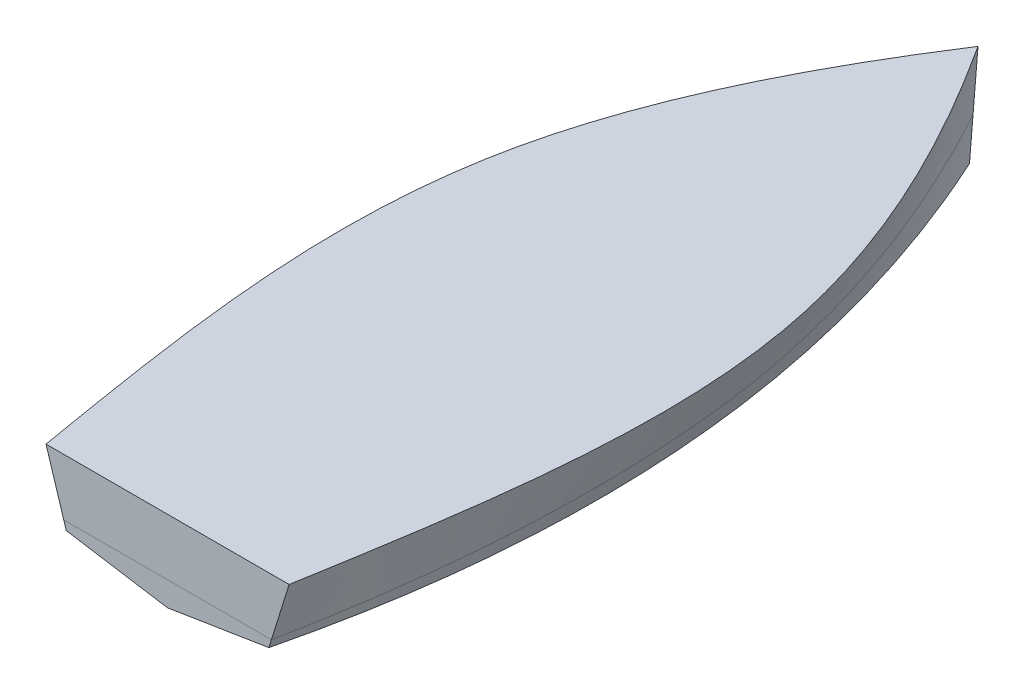
ISO-10303-21;
HEADER;
FILE_DESCRIPTION(('STEP AP214'),'2;1');
FILE_NAME('part.step','',(''),(''),'','','');
FILE_SCHEMA(('AUTOMOTIVE_DESIGN { 1 0 10303 214 1 1 1 1 }'));
ENDSEC;
DATA;
#1=APPLICATION_CONTEXT('core data for automotive mechanical design processes');
#2=APPLICATION_PROTOCOL_DEFINITION('international standard','automotive_design',2000,#1);
#3=PRODUCT_CONTEXT('',#1,'mechanical');
#4=PRODUCT('Part','Part','',(#3));
#5=PRODUCT_RELATED_PRODUCT_CATEGORY('part','',(#4));
#6=PRODUCT_DEFINITION_FORMATION('','',#4);
#7=PRODUCT_DEFINITION_CONTEXT('part definition',#1,'design');
#8=PRODUCT_DEFINITION('design','',#6,#7);
#9=PRODUCT_DEFINITION_SHAPE('','',#8);
#10=(LENGTH_UNIT() NAMED_UNIT(*) SI_UNIT(.MILLI.,.METRE.));
#11=(NAMED_UNIT(*) PLANE_ANGLE_UNIT() SI_UNIT($,.RADIAN.));
#12=(NAMED_UNIT(*) SI_UNIT($,.STERADIAN.) SOLID_ANGLE_UNIT());
#13=UNCERTAINTY_MEASURE_WITH_UNIT(LENGTH_MEASURE(1.E-05),#10,'distance_accuracy_value','');
#14=(GEOMETRIC_REPRESENTATION_CONTEXT(3) GLOBAL_UNCERTAINTY_ASSIGNED_CONTEXT((#13)) GLOBAL_UNIT_ASSIGNED_CONTEXT((#10,
#11,#12)) REPRESENTATION_CONTEXT('',''));
#15=CARTESIAN_POINT('',(0.,0.,0.));
#16=DIRECTION('',(0.,0.,1.));
#17=DIRECTION('',(1.,0.,0.));
#18=AXIS2_PLACEMENT_3D('',#15,#16,#17);
#19=CARTESIAN_POINT('',(0.,-70.,0.));
#20=DIRECTION('',(0.,1.,0.));
#21=DIRECTION('',(0.,0.,1.));
#22=AXIS2_PLACEMENT_3D('',#19,#20,#21);
#23=PLANE('',#22);
#24=CARTESIAN_POINT('',(0.,-70.,6.1242064468144));
#25=CARTESIAN_POINT('',(3.4128996424551,-70.,12.3696890501461));
#26=CARTESIAN_POINT('',(6.7876608261751,-70.,18.6360596045444));
#27=CARTESIAN_POINT('',(13.4590214502835,-70.,31.2133674528269));
#28=CARTESIAN_POINT('',(16.7555901693456,-70.,37.5243210394499));
#29=CARTESIAN_POINT('',(23.2669106603132,-70.,50.1904563174513));
#30=CARTESIAN_POINT('',(26.4816402437373,-70.,56.5456494207862));
#31=CARTESIAN_POINT('',(32.8256578527696,-70.,69.2998757351345));
#32=CARTESIAN_POINT('',(35.9549315288792,-70.,75.6989160859157));
#33=CARTESIAN_POINT('',(42.1244667860507,-70.,88.5404307637073));
#34=CARTESIAN_POINT('',(45.1647209844516,-70.,94.9829086389232));
#35=CARTESIAN_POINT('',(51.1527031471199,-70.,107.910861215993));
#36=CARTESIAN_POINT('',(54.1004296362348,-70.,114.396336601353));
#37=CARTESIAN_POINT('',(59.9053601677149,-70.,127.422050551303));
#38=CARTESIAN_POINT('',(62.7623869533534,-70.,133.962368140657));
#39=CARTESIAN_POINT('',(68.3766957798379,-70.,147.085151857913));
#40=CARTESIAN_POINT('',(71.1339847582742,-70.,153.667615016609));
#41=CARTESIAN_POINT('',(76.5455047257855,-70.,166.874135379851));
#42=CARTESIAN_POINT('',(79.1997443929159,-70.,173.498189027137));
#43=CARTESIAN_POINT('',(84.4019476211753,-70.,186.78729903778));
#44=CARTESIAN_POINT('',(86.9499197189154,-70.,193.452352058056));
#45=CARTESIAN_POINT('',(91.9364735276553,-70.,206.822825439343));
#46=CARTESIAN_POINT('',(94.3750616011719,-70.,213.528243426654));
#47=CARTESIAN_POINT('',(99.1398509410463,-70.,226.97877726238));
#48=CARTESIAN_POINT('',(101.466054243301,-70.,233.723892389179));
#49=CARTESIAN_POINT('',(105.811352322696,-70.,246.681019288286));
#50=CARTESIAN_POINT('',(107.839785803749,-70.,252.889900314483));
#51=CARTESIAN_POINT('',(111.79779212802,-70.,265.339193843847));
#52=CARTESIAN_POINT('',(113.727363740606,-70.,271.57960673846));
#53=CARTESIAN_POINT('',(117.485503538348,-70.,284.090759520209));
#54=CARTESIAN_POINT('',(119.314072024437,-70.,290.361499316927));
#55=CARTESIAN_POINT('',(122.868218090465,-70.,302.932065214998));
#56=CARTESIAN_POINT('',(124.593796306794,-70.,309.231891136364));
#57=CARTESIAN_POINT('',(127.940134509855,-70.,321.859338251998));
#58=CARTESIAN_POINT('',(129.56089432697,-70.,328.186959491225));
#59=CARTESIAN_POINT('',(132.69392395138,-70.,340.860507059389));
#60=CARTESIAN_POINT('',(134.206328602835,-70.,347.2064000417));
#61=CARTESIAN_POINT('',(137.123413883221,-70.,359.922957102391));
#62=CARTESIAN_POINT('',(138.528093477159,-70.,366.293621418151));
#63=CARTESIAN_POINT('',(141.22840967873,-70.,379.058067381411));
#64=CARTESIAN_POINT('',(142.524046184481,-70.,385.451849050506));
#65=CARTESIAN_POINT('',(144.384876863121,-70.,395.058450870037));
#66=CARTESIAN_POINT('',(144.991385520873,-70.,398.263320260298));
#67=CARTESIAN_POINT('',(146.176750380898,-70.,404.67817612804));
#68=CARTESIAN_POINT('',(146.755606599073,-70.,407.888162602577));
#69=CARTESIAN_POINT('',(147.885573202847,-70.,414.31301830618));
#70=CARTESIAN_POINT('',(148.43668355236,-70.,417.52788754159));
#71=CARTESIAN_POINT('',(149.511027257782,-70.,423.962283809902));
#72=CARTESIAN_POINT('',(150.034260564087,-70.,427.181810851083));
#73=CARTESIAN_POINT('',(151.187380478373,-70.,434.474838175855));
#74=CARTESIAN_POINT('',(151.809006140669,-70.,438.549647815221));
#75=CARTESIAN_POINT('',(153.00876033824,-70.,446.705655007056));
#76=CARTESIAN_POINT('',(153.586888742172,-70.,450.786852578776));
#77=CARTESIAN_POINT('',(155.257089620103,-70.,463.039685442321));
#78=CARTESIAN_POINT('',(156.284915577723,-70.,471.220166671037));
#79=CARTESIAN_POINT('',(158.174767411818,-70.,487.600755997638));
#80=CARTESIAN_POINT('',(159.036781034996,-70.,495.800865500724));
#81=CARTESIAN_POINT('',(160.600509670696,-70.,512.216666934043));
#82=CARTESIAN_POINT('',(161.302218269274,-70.,520.432359474509));
#83=CARTESIAN_POINT('',(162.550810494928,-70.,536.875166159789));
#84=CARTESIAN_POINT('',(163.09769961369,-70.,545.102279889069));
#85=CARTESIAN_POINT('',(164.04325397102,-70.,561.584151512414));
#86=CARTESIAN_POINT('',(164.441572157311,-70.,569.83892924329));
#87=CARTESIAN_POINT('',(165.093554072465,-70.,586.353631504746));
#88=CARTESIAN_POINT('',(165.347227102588,-70.,594.613555670188));
#89=CARTESIAN_POINT('',(165.715159262482,-70.,611.136387716201));
#90=CARTESIAN_POINT('',(165.829419935348,-70.,619.399295562735));
#91=CARTESIAN_POINT('',(165.923516119478,-70.,635.925937675694));
#92=CARTESIAN_POINT('',(165.903350235586,-70.,644.189671949807));
#93=CARTESIAN_POINT('',(165.733315193331,-70.,660.715803327388));
#94=CARTESIAN_POINT('',(165.583445599789,-70.,668.978200426278));
#95=CARTESIAN_POINT('',(165.137916634204,-70.,686.297685799774));
#96=CARTESIAN_POINT('',(164.829573639235,-70.,695.354448094582));
#97=CARTESIAN_POINT('',(164.067668455385,-70.,713.461950652483));
#98=CARTESIAN_POINT('',(163.614104269412,-70.,722.512690831043));
#99=CARTESIAN_POINT('',(162.566647651155,-70.,740.606504173481));
#100=CARTESIAN_POINT('',(161.972747835636,-70.,749.649576908834));
#101=CARTESIAN_POINT('',(160.648981412006,-70.,767.726357119366));
#102=CARTESIAN_POINT('',(159.919105645369,-70.,776.760063922476));
#103=CARTESIAN_POINT('',(158.327204625574,-70.,794.816378165157));
#104=CARTESIAN_POINT('',(157.465171125837,-70.,803.838984876649));
#105=CARTESIAN_POINT('',(155.612214684833,-70.,821.871323998958));
#106=CARTESIAN_POINT('',(154.621286328204,-70.,830.881055852765));
#107=CARTESIAN_POINT('',(152.519280702925,-70.,848.834131909316));
#108=CARTESIAN_POINT('',(151.408924673407,-70.,857.777560627335));
#109=CARTESIAN_POINT('',(149.065518391688,-70.,875.648101815468));
#110=CARTESIAN_POINT('',(147.832471148106,-70.,884.575214680212));
#111=CARTESIAN_POINT('',(145.245183357205,-70.,902.41108458568));
#112=CARTESIAN_POINT('',(143.89095296724,-70.,911.319843100917));
#113=CARTESIAN_POINT('',(141.062209296817,-70.,929.116923987394));
#114=CARTESIAN_POINT('',(139.587713837209,-70.,938.005249186469));
#115=CARTESIAN_POINT('',(137.285915840591,-70.,951.321131850524));
#116=CARTESIAN_POINT('',(136.503726512897,-70.,955.756532657071));
#117=CARTESIAN_POINT('',(134.90923470165,-70.,964.62192569371));
#118=CARTESIAN_POINT('',(134.096932223273,-70.,969.051917924732));
#119=CARTESIAN_POINT('',(132.442369187053,-70.,977.905037484698));
#120=CARTESIAN_POINT('',(131.600116959001,-70.,982.328166370821));
#121=CARTESIAN_POINT('',(129.885314170719,-70.,991.168549245602));
#122=CARTESIAN_POINT('',(129.012763594738,-70.,995.585803231204));
#123=CARTESIAN_POINT('',(128.125,-70.,1000.));
#124=B_SPLINE_CURVE_WITH_KNOTS('',3,(#24,#25,#26,#27,#28,#29,#30,#31,#32,#33,#34,#35,#36,#37,
#38,#39,#40,#41,#42,#43,#44,#45,#46,#47,#48,#49,#50,#51,#52,#53,#54,#55,#56,#57,#58,#59,#60,#61,
#62,#63,#64,#65,#66,#67,#68,#69,#70,#71,#72,#73,#74,#75,#76,#77,#78,#79,#80,#81,#82,#83,#84,#85,
#86,#87,#88,#89,#90,#91,#92,#93,#94,#95,#96,#97,#98,#99,#100,#101,#102,#103,#104,#105,#106,#107,
#108,#109,#110,#111,#112,#113,#114,#115,#116,#117,#118,#119,#120,#121,#122,#123),.UNSPECIFIED.,
.F.,.F.,(4,2,2,2,2,2,2,2,2,2,2,2,2,2,2,2,2,2,2,2,2,2,2,2,2,2,2,2,2,2,2,2,2,2,2,2,2,2,2,2,2,2,2,
2,2,2,2,2,2,4),(0.,21.3514016836477,42.7110577150538,64.0764444633371,85.4453970339877,
106.816116807164,128.187177116991,149.597711011566,171.006752751134,192.413987650576,
213.819499553865,235.223764748541,256.627642050524,276.222321493708,295.817244792058,
315.412109705655,335.006853527921,354.601629057411,374.171580051483,393.741719045032,
413.311876323387,423.097039618363,432.882197285851,442.667367678865,452.452555482618,
464.818154291249,477.183790436997,501.916259745676,526.650556047249,551.385841816156,
576.120250076345,600.912079783073,625.702315096618,650.492276015334,675.282494218722,
700.072795597889,727.257595537645,754.442769340425,781.62937370829,808.817809865744,
836.007943259661,863.199219383548,890.234637635139,917.269393090513,944.301884659544,
971.330377812152,984.841821579968,998.353263025514,1011.86097554307,1025.36869508331),.UNSPECIFIED.);
#125=CARTESIAN_POINT('',(0.,-70.,6.12420644681441));
#126=VERTEX_POINT('',#125);
#127=CARTESIAN_POINT('',(128.125,-70.,1000.));
#128=VERTEX_POINT('',#127);
#129=EDGE_CURVE('E165',#126,#128,#124,.T.);
#130=ORIENTED_EDGE('',*,*,#129,.F.);
#131=CARTESIAN_POINT('',(-128.125,-70.,1000.));
#132=CARTESIAN_POINT('',(-129.524865185264,-70.,993.039324332395));
#133=CARTESIAN_POINT('',(-130.886955129951,-70.,986.071058513881));
#134=CARTESIAN_POINT('',(-133.536063094098,-70.,972.11975164388));
#135=CARTESIAN_POINT('',(-134.82307571117,-70.,965.136709566501));
#136=CARTESIAN_POINT('',(-137.322377245818,-70.,951.156860148106));
#137=CARTESIAN_POINT('',(-138.534661927157,-70.,944.160052049871));
#138=CARTESIAN_POINT('',(-140.8845463001,-70.,930.15362179995));
#139=CARTESIAN_POINT('',(-142.022143043193,-70.,923.14399915359));
#140=CARTESIAN_POINT('',(-144.22246785447,-70.,909.112855564446));
#141=CARTESIAN_POINT('',(-145.285194285947,-70.,902.091334364987));
#142=CARTESIAN_POINT('',(-147.335353517863,-70.,888.037268705765));
#143=CARTESIAN_POINT('',(-148.32278591639,-70.,881.004724187365));
#144=CARTESIAN_POINT('',(-150.225347825442,-70.,866.902414755704));
#145=CARTESIAN_POINT('',(-151.140185728508,-70.,859.832610490352));
#146=CARTESIAN_POINT('',(-152.892438264752,-70.,845.683479721902));
#147=CARTESIAN_POINT('',(-153.729853643997,-70.,838.604153311228));
#148=CARTESIAN_POINT('',(-155.326133846802,-70.,824.436742326568));
#149=CARTESIAN_POINT('',(-156.084999728256,-70.,817.348657871835));
#150=CARTESIAN_POINT('',(-157.522826364551,-70.,803.164471916175));
#151=CARTESIAN_POINT('',(-158.201788102179,-70.,796.068370514937));
#152=CARTESIAN_POINT('',(-159.478228660789,-70.,781.868869768834));
#153=CARTESIAN_POINT('',(-160.075707853568,-70.,774.765470457418));
#154=CARTESIAN_POINT('',(-161.1873867516,-70.,760.552068484694));
#155=CARTESIAN_POINT('',(-161.701585512265,-70.,753.442065749408));
#156=CARTESIAN_POINT('',(-162.628364727964,-70.,739.46239318378));
#157=CARTESIAN_POINT('',(-163.043844552611,-70.,732.592915663125));
#158=CARTESIAN_POINT('',(-163.793292727491,-70.,718.849456637679));
#159=CARTESIAN_POINT('',(-164.127260489122,-70.,711.975475100723));
#160=CARTESIAN_POINT('',(-164.711504901674,-70.,698.223961342942));
#161=CARTESIAN_POINT('',(-164.961781718788,-70.,691.346429129195));
#162=CARTESIAN_POINT('',(-165.376305071745,-70.,677.588760623637));
#163=CARTESIAN_POINT('',(-165.540551583811,-70.,670.708624331107));
#164=CARTESIAN_POINT('',(-165.780520227699,-70.,656.94669021801));
#165=CARTESIAN_POINT('',(-165.856240982989,-70.,650.064892373272));
#166=CARTESIAN_POINT('',(-165.916513527929,-70.,636.300572879547));
#167=CARTESIAN_POINT('',(-165.901061177205,-70.,629.418051211882));
#168=CARTESIAN_POINT('',(-165.776304090553,-70.,615.665037054963));
#169=CARTESIAN_POINT('',(-165.667151988758,-70.,608.794543201619));
#170=CARTESIAN_POINT('',(-165.352313516021,-70.,595.055562554666));
#171=CARTESIAN_POINT('',(-165.146624462142,-70.,588.187075822148));
#172=CARTESIAN_POINT('',(-164.635728533983,-70.,574.45387731137));
#173=CARTESIAN_POINT('',(-164.330522923748,-70.,567.589165486272));
#174=CARTESIAN_POINT('',(-163.617531894974,-70.,553.865287040966));
#175=CARTESIAN_POINT('',(-163.209749950602,-70.,547.006120240845));
#176=CARTESIAN_POINT('',(-162.288476134433,-70.,533.295112770006));
#177=CARTESIAN_POINT('',(-161.774987883591,-70.,526.443271856419));
#178=CARTESIAN_POINT('',(-160.639109404853,-70.,512.748674689519));
#179=CARTESIAN_POINT('',(-160.016720533441,-70.,505.905918324118));
#180=CARTESIAN_POINT('',(-158.802352475327,-70.,493.667851261194));
#181=CARTESIAN_POINT('',(-158.231450600031,-70.,488.270441327337));
#182=CARTESIAN_POINT('',(-157.01810347386,-70.,477.483653629842));
#183=CARTESIAN_POINT('',(-156.3756582558,-70.,472.09427586252));
#184=CARTESIAN_POINT('',(-155.017666810365,-70.,461.324844191656));
#185=CARTESIAN_POINT('',(-154.302121995375,-70.,455.944790110009));
#186=CARTESIAN_POINT('',(-152.796374909512,-70.,445.195248361081));
#187=CARTESIAN_POINT('',(-152.006174534148,-70.,439.825760429058));
#188=CARTESIAN_POINT('',(-150.763753537846,-70.,431.780437646124));
#189=CARTESIAN_POINT('',(-150.340095842457,-70.,429.100164266645));
#190=CARTESIAN_POINT('',(-149.473526904917,-70.,423.742726875653));
#191=CARTESIAN_POINT('',(-149.030615664127,-70.,421.065562863921));
#192=CARTESIAN_POINT('',(-148.125526383158,-70.,415.714502218447));
#193=CARTESIAN_POINT('',(-147.663348402903,-70.,413.040605574568));
#194=CARTESIAN_POINT('',(-146.719792486462,-70.,407.696206867928));
#195=CARTESIAN_POINT('',(-146.238414547799,-70.,405.025704805604));
#196=CARTESIAN_POINT('',(-144.764753904432,-70.,397.015097659039));
#197=CARTESIAN_POINT('',(-143.743683033356,-70.,391.680258205506));
#198=CARTESIAN_POINT('',(-141.625362336594,-70.,381.025605163443));
#199=CARTESIAN_POINT('',(-140.528110531199,-70.,375.70579196914));
#200=CARTESIAN_POINT('',(-138.258080201386,-70.,365.082161708178));
#201=CARTESIAN_POINT('',(-137.085299798625,-70.,359.778345042778));
#202=CARTESIAN_POINT('',(-134.664974988178,-70.,349.187691517259));
#203=CARTESIAN_POINT('',(-133.417429070536,-70.,343.900855002343));
#204=CARTESIAN_POINT('',(-130.84843008433,-70.,333.34510322034));
#205=CARTESIAN_POINT('',(-129.526976200643,-70.,328.076188151587));
#206=CARTESIAN_POINT('',(-126.811128784169,-70.,317.557239395197));
#207=CARTESIAN_POINT('',(-125.41673550701,-70.,312.307205641458));
#208=CARTESIAN_POINT('',(-121.601657253838,-70.,298.3304776229));
#209=CARTESIAN_POINT('',(-119.116938529498,-70.,289.621178434271));
#210=CARTESIAN_POINT('',(-113.952500861593,-70.,272.259976641048));
#211=CARTESIAN_POINT('',(-111.272767034144,-70.,263.608078472502));
#212=CARTESIAN_POINT('',(-105.723667609138,-70.,246.363919546693));
#213=CARTESIAN_POINT('',(-102.854274156212,-70.,237.771667755406));
#214=CARTESIAN_POINT('',(-96.9316786498619,-70.,220.649010353046));
#215=CARTESIAN_POINT('',(-93.8784426375835,-70.,212.118616496257));
#216=CARTESIAN_POINT('',(-87.594366973037,-70.,195.12171629301));
#217=CARTESIAN_POINT('',(-84.3634940679376,-70.,186.655222247975));
#218=CARTESIAN_POINT('',(-77.7307016493555,-70.,169.788049748855));
#219=CARTESIAN_POINT('',(-74.3287560776231,-70.,161.387381548167));
#220=CARTESIAN_POINT('',(-67.3580411247748,-70.,144.647318160627));
#221=CARTESIAN_POINT('',(-63.7891342019362,-70.,136.30798028179));
#222=CARTESIAN_POINT('',(-56.494063612077,-70.,119.698764546647));
#223=CARTESIAN_POINT('',(-52.7679054836293,-70.,111.428884256243));
#224=CARTESIAN_POINT('',(-45.1656954248909,-70.,94.9601005781718));
#225=CARTESIAN_POINT('',(-41.2896697441662,-70.,86.761185066026));
#226=CARTESIAN_POINT('',(-33.3952856535435,-70.,70.4357461332823));
#227=CARTESIAN_POINT('',(-29.3769775831998,-70.,62.3091983576318));
#228=CARTESIAN_POINT('',(-21.2057721842017,-70.,46.1298462687645));
#229=CARTESIAN_POINT('',(-17.0529518865324,-70.,38.0770030214787));
#230=CARTESIAN_POINT('',(-8.62058019226114,-70.,22.0462676824625));
#231=CARTESIAN_POINT('',(-4.34113437202077,-70.,14.0683200712468));
#232=CARTESIAN_POINT('',(0.,-70.,6.1242064468144));
#233=B_SPLINE_CURVE_WITH_KNOTS('',3,(#131,#132,#133,#134,#135,#136,#137,#138,#139,#140,#141,
#142,#143,#144,#145,#146,#147,#148,#149,#150,#151,#152,#153,#154,#155,#156,#157,#158,#159,#160,
#161,#162,#163,#164,#165,#166,#167,#168,#169,#170,#171,#172,#173,#174,#175,#176,#177,#178,#179,
#180,#181,#182,#183,#184,#185,#186,#187,#188,#189,#190,#191,#192,#193,#194,#195,#196,#197,#198,
#199,#200,#201,#202,#203,#204,#205,#206,#207,#208,#209,#210,#211,#212,#213,#214,#215,#216,#217,
#218,#219,#220,#221,#222,#223,#224,#225,#226,#227,#228,#229,#230,#231,#232),.UNSPECIFIED.,.F.,
.F.,(4,2,2,2,2,2,2,2,2,2,2,2,2,2,2,2,2,2,2,2,2,2,2,2,2,2,2,2,2,2,2,2,2,2,2,2,2,2,2,2,2,2,2,2,2,
2,2,2,2,2,4),(0.,21.3000182345958,42.6015672829351,63.9043227817396,85.2079187597195,
106.511980301573,127.816155554075,149.201979906134,170.587598156551,191.972928350658,
213.357995486774,234.742965041852,256.1281771339,276.773799447431,297.419570839745,
318.065301233455,338.711037333568,359.357094460485,380.00408917814,400.617514234728,
421.231512209361,441.845248358074,462.458286432554,483.070618527844,503.682693890787,
519.964806338256,536.246911317709,552.528701764049,568.810078926069,576.950669978355,
585.091260455219,593.231825615247,601.372391825559,617.666808893998,633.961649563301,
650.256895630504,666.552470905676,682.848225938436,699.143923863789,726.311833377782,
753.48181857195,780.655803135732,807.834822688567,835.018947470422,862.207225628782,
889.418309900553,916.62843656442,943.833818726217,971.029669947632,998.210213119971,
1025.36869942228),.UNSPECIFIED.);
#234=CARTESIAN_POINT('',(-128.125,-70.,1000.));
#235=VERTEX_POINT('',#234);
#236=EDGE_CURVE('E122',#235,#126,#233,.T.);
#237=ORIENTED_EDGE('',*,*,#236,.F.);
#238=DIRECTION('',(1.,0.,0.));
#239=VECTOR('',#238,1.);
#240=CARTESIAN_POINT('',(0.,-70.,1000.));
#241=LINE('',#240,#239);
#242=EDGE_CURVE('E177',#235,#128,#241,.T.);
#243=ORIENTED_EDGE('',*,*,#242,.T.);
#244=EDGE_LOOP('',(#130,#237,#243));
#245=FACE_BOUND('',#244,.T.);
#246=ADVANCED_FACE('F115',(#245),#23,.T.);
#247=CARTESIAN_POINT('',(0.,-99.9999999999999,1000.));
#248=CARTESIAN_POINT('',(125.,-80.,1000.));
#249=CARTESIAN_POINT('',(0.,-115.305484701074,693.919038165694));
#250=CARTESIAN_POINT('',(162.706723429762,-87.8942826179134,804.714915259377));
#251=CARTESIAN_POINT('',(0.,-135.21926549653,448.07972280961));
#252=CARTESIAN_POINT('',(168.381704633294,-101.518806023427,467.677804153326));
#253=CARTESIAN_POINT('',(0.,-129.362222737129,198.294814366418));
#254=CARTESIAN_POINT('',(65.5150263794691,-114.47570894943,147.155977364546));
#255=CARTESIAN_POINT('',(0.,-120.,10.4986396231104));
#256=CARTESIAN_POINT('',(0.,-120.,10.4986396231104));
#257=B_SPLINE_SURFACE_WITH_KNOTS('',3,1,((#247,#248),(#249,#250),(#251,#252),(#253,#254),(#255,
#256)),.UNSPECIFIED.,.F.,.F.,.F.,(4,1,4),(2,2),(0.,0.563838915793415,1.),(0.,1.),.UNSPECIFIED.);
#258=CARTESIAN_POINT('',(0.,-120.,10.4986396231104));
#259=CARTESIAN_POINT('',(0.,-125.366264366616,118.140163330415));
#260=CARTESIAN_POINT('',(0.,-131.625670877281,281.61288397238));
#261=CARTESIAN_POINT('',(0.,-129.747891563913,459.633258220467));
#262=CARTESIAN_POINT('',(0.,-118.755700759509,658.707199356744));
#263=CARTESIAN_POINT('',(0.,-106.7862842881,864.287053775103));
#264=CARTESIAN_POINT('',(0.,-99.9999999999999,1000.));
#265=B_SPLINE_CURVE_WITH_KNOTS('',3,(#258,#259,#260,#261,#262,#263,#264),.UNSPECIFIED.,.F.,.F.,
(4,1,1,1,4),(0.,0.25,0.5,0.75,1.),.UNSPECIFIED.);
#266=CARTESIAN_POINT('',(0.,-100.,1000.));
#267=VERTEX_POINT('',#266);
#268=CARTESIAN_POINT('',(0.,-120.,10.4986396231104));
#269=VERTEX_POINT('',#268);
#270=EDGE_CURVE('E172',#267,#269,#265,.F.);
#271=CARTESIAN_POINT('',(125.,-80.,1000.));
#272=CARTESIAN_POINT('',(162.706723429762,-87.8942826179134,804.714915259377));
#273=CARTESIAN_POINT('',(168.381704633294,-101.518806023427,467.677804153326));
#274=CARTESIAN_POINT('',(65.5150263794691,-114.47570894943,147.155977364546));
#275=CARTESIAN_POINT('',(0.,-120.,10.4986396231104));
#276=B_SPLINE_CURVE_WITH_KNOTS('',3,(#271,#272,#273,#274,#275),.UNSPECIFIED.,.F.,.F.,(4,1,4),
(0.,0.563838915793415,1.),.UNSPECIFIED.);
#277=CARTESIAN_POINT('',(125.,-80.,1000.));
#278=VERTEX_POINT('',#277);
#279=EDGE_CURVE('E167',#269,#278,#276,.F.);
#280=DIRECTION('',(0.987440631916705,0.157990501106673,0.));
#281=VECTOR('',#280,1.);
#282=CARTESIAN_POINT('',(62.5,-90.,1000.));
#283=LINE('',#282,#281);
#284=EDGE_CURVE('E179',#267,#278,#283,.T.);
#285=ORIENTED_EDGE('',*,*,#270,.T.);
#286=ORIENTED_EDGE('',*,*,#279,.T.);
#287=ORIENTED_EDGE('',*,*,#284,.F.);
#288=EDGE_LOOP('',(#285,#286,#287));
#289=FACE_BOUND('',#288,.T.);
#290=ADVANCED_FACE('F218',(#289),#257,.T.);
#291=CARTESIAN_POINT('',(0.,-99.9999999999999,1000.));
#292=CARTESIAN_POINT('',(-125.,-80.,1000.));
#293=CARTESIAN_POINT('',(0.,-115.305484701074,693.919038165694));
#294=CARTESIAN_POINT('',(-162.706723429762,-87.8942826179134,804.714915259377));
#295=CARTESIAN_POINT('',(0.,-135.21926549653,448.07972280961));
#296=CARTESIAN_POINT('',(-168.381704633294,-101.518806023427,467.677804153326));
#297=CARTESIAN_POINT('',(0.,-129.362222737129,198.294814366418));
#298=CARTESIAN_POINT('',(-65.5150263794691,-114.47570894943,147.155977364546));
#299=CARTESIAN_POINT('',(0.,-120.,10.4986396231104));
#300=CARTESIAN_POINT('',(0.,-120.,10.4986396231104));
#301=B_SPLINE_SURFACE_WITH_KNOTS('',3,1,((#291,#292),(#293,#294),(#295,#296),(#297,#298),(#299,
#300)),.UNSPECIFIED.,.F.,.F.,.F.,(4,1,4),(2,2),(0.,0.563838915793415,1.),(0.,1.),.UNSPECIFIED.);
#302=DIRECTION('',(-0.987440631916705,0.157990501106673,0.));
#303=VECTOR('',#302,1.);
#304=CARTESIAN_POINT('',(-62.5,-90.,1000.));
#305=LINE('',#304,#303);
#306=CARTESIAN_POINT('',(-125.,-80.,1000.));
#307=VERTEX_POINT('',#306);
#308=EDGE_CURVE('E141',#267,#307,#305,.T.);
#309=CARTESIAN_POINT('',(-125.,-80.,1000.));
#310=CARTESIAN_POINT('',(-162.706723429762,-87.8942826179134,804.714915259377));
#311=CARTESIAN_POINT('',(-168.381704633294,-101.518806023427,467.677804153326));
#312=CARTESIAN_POINT('',(-65.5150263794691,-114.47570894943,147.155977364546));
#313=CARTESIAN_POINT('',(0.,-120.,10.4986396231104));
#314=B_SPLINE_CURVE_WITH_KNOTS('',3,(#309,#310,#311,#312,#313),.UNSPECIFIED.,.F.,.F.,(4,1,4),
(0.,0.563838915793415,1.),.UNSPECIFIED.);
#315=EDGE_CURVE('E14',#269,#307,#314,.F.);
#316=ORIENTED_EDGE('',*,*,#270,.F.);
#317=ORIENTED_EDGE('',*,*,#308,.T.);
#318=ORIENTED_EDGE('',*,*,#315,.F.);
#319=EDGE_LOOP('',(#316,#317,#318));
#320=FACE_BOUND('',#319,.T.);
#321=ADVANCED_FACE('F223',(#320),#301,.F.);
#322=CARTESIAN_POINT('',(0.,0.,0.));
#323=CARTESIAN_POINT('',(0.,-120.,10.4986396231104));
#324=CARTESIAN_POINT('',(84.332846091483,0.,130.175398142349));
#325=CARTESIAN_POINT('',(65.5150263794691,-114.47570894943,147.155977364546));
#326=CARTESIAN_POINT('',(242.400035949062,0.,444.807296936932));
#327=CARTESIAN_POINT('',(168.381704633294,-101.518806023427,467.677804153326));
#328=CARTESIAN_POINT('',(184.554636374516,0.,796.914087000553));
#329=CARTESIAN_POINT('',(162.706723429762,-87.8942826179134,804.714915259377));
#330=CARTESIAN_POINT('',(150.,0.,1000.));
#331=CARTESIAN_POINT('',(125.,-80.,1000.));
#332=B_SPLINE_SURFACE_WITH_KNOTS('',3,1,((#322,#323),(#324,#325),(#326,#327),(#328,#329),(#330,
#331)),.UNSPECIFIED.,.F.,.F.,.F.,(4,1,4),(2,2),(0.,0.436161084206585,1.),(0.,1.),.UNSPECIFIED.);
#333=CARTESIAN_POINT('',(0.,0.,0.));
#334=CARTESIAN_POINT('',(0.,-40.,3.4995465410368));
#335=CARTESIAN_POINT('',(0.,-80.,6.99909308207361));
#336=CARTESIAN_POINT('',(0.,-120.,10.4986396231104));
#337=B_SPLINE_CURVE_WITH_KNOTS('',3,(#333,#334,#335,#336),.UNSPECIFIED.,.F.,.F.,(4,4),(0.,1.),.UNSPECIFIED.);
#338=EDGE_CURVE('E161',#269,#126,#337,.F.);
#339=DIRECTION('',(0.298274993135947,0.95447997803503,0.));
#340=VECTOR('',#339,1.);
#341=CARTESIAN_POINT('',(137.5,-40.,1000.));
#342=LINE('',#341,#340);
#343=EDGE_CURVE('E182',#278,#128,#342,.T.);
#344=ORIENTED_EDGE('',*,*,#338,.T.);
#345=ORIENTED_EDGE('',*,*,#129,.T.);
#346=ORIENTED_EDGE('',*,*,#343,.F.);
#347=ORIENTED_EDGE('',*,*,#279,.F.);
#348=EDGE_LOOP('',(#344,#345,#346,#347));
#349=FACE_BOUND('',#348,.T.);
#350=ADVANCED_FACE('F163',(#349),#332,.T.);
#351=CARTESIAN_POINT('',(0.,0.,1000.));
#352=DIRECTION('',(0.,0.,-1.));
#353=DIRECTION('',(1.,0.,0.));
#354=AXIS2_PLACEMENT_3D('',#351,#352,#353);
#355=PLANE('',#354);
#356=ORIENTED_EDGE('',*,*,#242,.F.);
#357=DIRECTION('',(-0.298274993135947,0.95447997803503,0.));
#358=VECTOR('',#357,1.);
#359=CARTESIAN_POINT('',(-137.5,-40.,1000.));
#360=LINE('',#359,#358);
#361=EDGE_CURVE('E134',#307,#235,#360,.T.);
#362=ORIENTED_EDGE('',*,*,#361,.F.);
#363=ORIENTED_EDGE('',*,*,#308,.F.);
#364=ORIENTED_EDGE('',*,*,#284,.T.);
#365=ORIENTED_EDGE('',*,*,#343,.T.);
#366=EDGE_LOOP('',(#356,#362,#363,#364,#365));
#367=FACE_BOUND('',#366,.T.);
#368=ADVANCED_FACE('F219',(#367),#355,.F.);
#369=CARTESIAN_POINT('',(0.,0.,0.));
#370=CARTESIAN_POINT('',(0.,-120.,10.4986396231104));
#371=CARTESIAN_POINT('',(-84.332846091483,0.,130.175398142349));
#372=CARTESIAN_POINT('',(-65.5150263794691,-114.47570894943,147.155977364546));
#373=CARTESIAN_POINT('',(-242.400035949062,0.,444.807296936932));
#374=CARTESIAN_POINT('',(-168.381704633294,-101.518806023427,467.677804153326));
#375=CARTESIAN_POINT('',(-184.554636374516,0.,796.914087000553));
#376=CARTESIAN_POINT('',(-162.706723429762,-87.8942826179134,804.714915259377));
#377=CARTESIAN_POINT('',(-150.,0.,1000.));
#378=CARTESIAN_POINT('',(-125.,-80.,1000.));
#379=B_SPLINE_SURFACE_WITH_KNOTS('',3,1,((#369,#370),(#371,#372),(#373,#374),(#375,#376),(#377,
#378)),.UNSPECIFIED.,.F.,.F.,.F.,(4,1,4),(2,2),(0.,0.436161084206585,1.),(0.,1.),.UNSPECIFIED.);
#380=ORIENTED_EDGE('',*,*,#361,.T.);
#381=ORIENTED_EDGE('',*,*,#236,.T.);
#382=ORIENTED_EDGE('',*,*,#338,.F.);
#383=ORIENTED_EDGE('',*,*,#315,.T.);
#384=EDGE_LOOP('',(#380,#381,#382,#383));
#385=FACE_BOUND('',#384,.T.);
#386=ADVANCED_FACE('F117',(#385),#379,.F.);
#387=CLOSED_SHELL('',(#246,#290,#321,#350,#368,#386));
#388=MANIFOLD_SOLID_BREP('B2',#387);
#389=CARTESIAN_POINT('',(0.,-70.,0.));
#390=DIRECTION('',(0.,1.,0.));
#391=DIRECTION('',(0.,0.,1.));
#392=AXIS2_PLACEMENT_3D('',#389,#390,#391);
#393=PLANE('',#392);
#394=CARTESIAN_POINT('',(0.,-70.,6.1242064468144));
#395=CARTESIAN_POINT('',(3.4128996424551,-70.,12.3696890501461));
#396=CARTESIAN_POINT('',(6.7876608261751,-70.,18.6360596045444));
#397=CARTESIAN_POINT('',(13.4590214502835,-70.,31.2133674528269));
#398=CARTESIAN_POINT('',(16.7555901693456,-70.,37.5243210394499));
#399=CARTESIAN_POINT('',(23.2669106603132,-70.,50.1904563174513));
#400=CARTESIAN_POINT('',(26.4816402437373,-70.,56.5456494207862));
#401=CARTESIAN_POINT('',(32.8256578527696,-70.,69.2998757351345));
#402=CARTESIAN_POINT('',(35.9549315288792,-70.,75.6989160859157));
#403=CARTESIAN_POINT('',(42.1244667860507,-70.,88.5404307637073));
#404=CARTESIAN_POINT('',(45.1647209844516,-70.,94.9829086389232));
#405=CARTESIAN_POINT('',(51.1527031471199,-70.,107.910861215993));
#406=CARTESIAN_POINT('',(54.1004296362348,-70.,114.396336601353));
#407=CARTESIAN_POINT('',(59.9053601677149,-70.,127.422050551303));
#408=CARTESIAN_POINT('',(62.7623869533534,-70.,133.962368140657));
#409=CARTESIAN_POINT('',(68.3766957798379,-70.,147.085151857913));
#410=CARTESIAN_POINT('',(71.1339847582742,-70.,153.667615016609));
#411=CARTESIAN_POINT('',(76.5455047257855,-70.,166.874135379851));
#412=CARTESIAN_POINT('',(79.1997443929159,-70.,173.498189027137));
#413=CARTESIAN_POINT('',(84.4019476211753,-70.,186.78729903778));
#414=CARTESIAN_POINT('',(86.9499197189154,-70.,193.452352058056));
#415=CARTESIAN_POINT('',(91.9364735276553,-70.,206.822825439343));
#416=CARTESIAN_POINT('',(94.3750616011719,-70.,213.528243426654));
#417=CARTESIAN_POINT('',(99.1398509410463,-70.,226.97877726238));
#418=CARTESIAN_POINT('',(101.466054243301,-70.,233.723892389179));
#419=CARTESIAN_POINT('',(105.811352322696,-70.,246.681019288286));
#420=CARTESIAN_POINT('',(107.839785803749,-70.,252.889900314483));
#421=CARTESIAN_POINT('',(111.79779212802,-70.,265.339193843847));
#422=CARTESIAN_POINT('',(113.727363740606,-70.,271.57960673846));
#423=CARTESIAN_POINT('',(117.485503538348,-70.,284.090759520209));
#424=CARTESIAN_POINT('',(119.314072024437,-70.,290.361499316927));
#425=CARTESIAN_POINT('',(122.868218090465,-70.,302.932065214998));
#426=CARTESIAN_POINT('',(124.593796306794,-70.,309.231891136364));
#427=CARTESIAN_POINT('',(127.940134509855,-70.,321.859338251998));
#428=CARTESIAN_POINT('',(129.56089432697,-70.,328.186959491225));
#429=CARTESIAN_POINT('',(132.69392395138,-70.,340.860507059389));
#430=CARTESIAN_POINT('',(134.206328602835,-70.,347.2064000417));
#431=CARTESIAN_POINT('',(137.123413883221,-70.,359.922957102391));
#432=CARTESIAN_POINT('',(138.528093477159,-70.,366.293621418151));
#433=CARTESIAN_POINT('',(141.22840967873,-70.,379.058067381411));
#434=CARTESIAN_POINT('',(142.524046184481,-70.,385.451849050506));
#435=CARTESIAN_POINT('',(144.384876863121,-70.,395.058450870037));
#436=CARTESIAN_POINT('',(144.991385520873,-70.,398.263320260298));
#437=CARTESIAN_POINT('',(146.176750380898,-70.,404.67817612804));
#438=CARTESIAN_POINT('',(146.755606599073,-70.,407.888162602577));
#439=CARTESIAN_POINT('',(147.885573202847,-70.,414.31301830618));
#440=CARTESIAN_POINT('',(148.43668355236,-70.,417.52788754159));
#441=CARTESIAN_POINT('',(149.511027257782,-70.,423.962283809902));
#442=CARTESIAN_POINT('',(150.034260564087,-70.,427.181810851083));
#443=CARTESIAN_POINT('',(151.187380478373,-70.,434.474838175855));
#444=CARTESIAN_POINT('',(151.809006140669,-70.,438.549647815221));
#445=CARTESIAN_POINT('',(153.00876033824,-70.,446.705655007056));
#446=CARTESIAN_POINT('',(153.586888742172,-70.,450.786852578776));
#447=CARTESIAN_POINT('',(155.257089620103,-70.,463.039685442321));
#448=CARTESIAN_POINT('',(156.284915577723,-70.,471.220166671037));
#449=CARTESIAN_POINT('',(158.174767411818,-70.,487.600755997638));
#450=CARTESIAN_POINT('',(159.036781034996,-70.,495.800865500724));
#451=CARTESIAN_POINT('',(160.600509670696,-70.,512.216666934043));
#452=CARTESIAN_POINT('',(161.302218269274,-70.,520.432359474509));
#453=CARTESIAN_POINT('',(162.550810494928,-70.,536.875166159789));
#454=CARTESIAN_POINT('',(163.09769961369,-70.,545.102279889069));
#455=CARTESIAN_POINT('',(164.04325397102,-70.,561.584151512414));
#456=CARTESIAN_POINT('',(164.441572157311,-70.,569.83892924329));
#457=CARTESIAN_POINT('',(165.093554072465,-70.,586.353631504746));
#458=CARTESIAN_POINT('',(165.347227102588,-70.,594.613555670188));
#459=CARTESIAN_POINT('',(165.715159262482,-70.,611.136387716201));
#460=CARTESIAN_POINT('',(165.829419935348,-70.,619.399295562735));
#461=CARTESIAN_POINT('',(165.923516119478,-70.,635.925937675694));
#462=CARTESIAN_POINT('',(165.903350235586,-70.,644.189671949807));
#463=CARTESIAN_POINT('',(165.733315193331,-70.,660.715803327388));
#464=CARTESIAN_POINT('',(165.583445599789,-70.,668.978200426278));
#465=CARTESIAN_POINT('',(165.137916634204,-70.,686.297685799774));
#466=CARTESIAN_POINT('',(164.829573639235,-70.,695.354448094582));
#467=CARTESIAN_POINT('',(164.067668455385,-70.,713.461950652483));
#468=CARTESIAN_POINT('',(163.614104269412,-70.,722.512690831043));
#469=CARTESIAN_POINT('',(162.566647651155,-70.,740.606504173481));
#470=CARTESIAN_POINT('',(161.972747835636,-70.,749.649576908834));
#471=CARTESIAN_POINT('',(160.648981412006,-70.,767.726357119366));
#472=CARTESIAN_POINT('',(159.919105645369,-70.,776.760063922476));
#473=CARTESIAN_POINT('',(158.327204625574,-70.,794.816378165157));
#474=CARTESIAN_POINT('',(157.465171125837,-70.,803.838984876649));
#475=CARTESIAN_POINT('',(155.612214684833,-70.,821.871323998958));
#476=CARTESIAN_POINT('',(154.621286328204,-70.,830.881055852765));
#477=CARTESIAN_POINT('',(152.519280702925,-70.,848.834131909316));
#478=CARTESIAN_POINT('',(151.408924673407,-70.,857.777560627335));
#479=CARTESIAN_POINT('',(149.065518391688,-70.,875.648101815468));
#480=CARTESIAN_POINT('',(147.832471148106,-70.,884.575214680212));
#481=CARTESIAN_POINT('',(145.245183357205,-70.,902.41108458568));
#482=CARTESIAN_POINT('',(143.89095296724,-70.,911.319843100917));
#483=CARTESIAN_POINT('',(141.062209296817,-70.,929.116923987394));
#484=CARTESIAN_POINT('',(139.587713837209,-70.,938.005249186469));
#485=CARTESIAN_POINT('',(137.285915840591,-70.,951.321131850524));
#486=CARTESIAN_POINT('',(136.503726512897,-70.,955.756532657071));
#487=CARTESIAN_POINT('',(134.90923470165,-70.,964.62192569371));
#488=CARTESIAN_POINT('',(134.096932223273,-70.,969.051917924732));
#489=CARTESIAN_POINT('',(132.442369187053,-70.,977.905037484698));
#490=CARTESIAN_POINT('',(131.600116959001,-70.,982.328166370821));
#491=CARTESIAN_POINT('',(129.885314170719,-70.,991.168549245602));
#492=CARTESIAN_POINT('',(129.012763594738,-70.,995.585803231204));
#493=CARTESIAN_POINT('',(128.125,-70.,1000.));
#494=B_SPLINE_CURVE_WITH_KNOTS('',3,(#394,#395,#396,#397,#398,#399,#400,#401,#402,#403,#404,
#405,#406,#407,#408,#409,#410,#411,#412,#413,#414,#415,#416,#417,#418,#419,#420,#421,#422,#423,
#424,#425,#426,#427,#428,#429,#430,#431,#432,#433,#434,#435,#436,#437,#438,#439,#440,#441,#442,
#443,#444,#445,#446,#447,#448,#449,#450,#451,#452,#453,#454,#455,#456,#457,#458,#459,#460,#461,
#462,#463,#464,#465,#466,#467,#468,#469,#470,#471,#472,#473,#474,#475,#476,#477,#478,#479,#480,
#481,#482,#483,#484,#485,#486,#487,#488,#489,#490,#491,#492,#493),.UNSPECIFIED.,.F.,.F.,(4,2,2,
2,2,2,2,2,2,2,2,2,2,2,2,2,2,2,2,2,2,2,2,2,2,2,2,2,2,2,2,2,2,2,2,2,2,2,2,2,2,2,2,2,2,2,2,2,2,4),
(0.,21.3514016836477,42.7110577150538,64.0764444633371,85.4453970339877,106.816116807164,
128.187177116991,149.597711011566,171.006752751134,192.413987650576,213.819499553865,
235.223764748541,256.627642050524,276.222321493708,295.817244792058,315.412109705655,
335.006853527921,354.601629057411,374.171580051483,393.741719045032,413.311876323387,
423.097039618363,432.882197285851,442.667367678865,452.452555482618,464.818154291249,
477.183790436997,501.916259745676,526.650556047249,551.385841816156,576.120250076345,
600.912079783073,625.702315096618,650.492276015334,675.282494218722,700.072795597889,
727.257595537645,754.442769340425,781.62937370829,808.817809865744,836.007943259661,
863.199219383548,890.234637635139,917.269393090513,944.301884659544,971.330377812152,
984.841821579968,998.353263025514,1011.86097554307,1025.36869508331),.UNSPECIFIED.);
#495=CARTESIAN_POINT('',(0.,-70.,6.12420644681441));
#496=VERTEX_POINT('',#495);
#497=CARTESIAN_POINT('',(128.125,-70.,1000.));
#498=VERTEX_POINT('',#497);
#499=EDGE_CURVE('E361',#496,#498,#494,.T.);
#500=ORIENTED_EDGE('',*,*,#499,.T.);
#501=DIRECTION('',(1.,0.,0.));
#502=VECTOR('',#501,1.);
#503=CARTESIAN_POINT('',(0.,-70.,1000.));
#504=LINE('',#503,#502);
#505=CARTESIAN_POINT('',(-128.125,-70.,1000.));
#506=VERTEX_POINT('',#505);
#507=EDGE_CURVE('E420',#506,#498,#504,.T.);
#508=ORIENTED_EDGE('',*,*,#507,.F.);
#509=CARTESIAN_POINT('',(-128.125,-70.,1000.));
#510=CARTESIAN_POINT('',(-129.524865185264,-70.,993.039324332395));
#511=CARTESIAN_POINT('',(-130.886955129951,-70.,986.071058513881));
#512=CARTESIAN_POINT('',(-133.536063094098,-70.,972.11975164388));
#513=CARTESIAN_POINT('',(-134.82307571117,-70.,965.136709566501));
#514=CARTESIAN_POINT('',(-137.322377245818,-70.,951.156860148106));
#515=CARTESIAN_POINT('',(-138.534661927157,-70.,944.160052049871));
#516=CARTESIAN_POINT('',(-140.8845463001,-70.,930.15362179995));
#517=CARTESIAN_POINT('',(-142.022143043193,-70.,923.14399915359));
#518=CARTESIAN_POINT('',(-144.22246785447,-70.,909.112855564446));
#519=CARTESIAN_POINT('',(-145.285194285947,-70.,902.091334364987));
#520=CARTESIAN_POINT('',(-147.335353517863,-70.,888.037268705765));
#521=CARTESIAN_POINT('',(-148.32278591639,-70.,881.004724187365));
#522=CARTESIAN_POINT('',(-150.225347825442,-70.,866.902414755704));
#523=CARTESIAN_POINT('',(-151.140185728508,-70.,859.832610490352));
#524=CARTESIAN_POINT('',(-152.892438264752,-70.,845.683479721902));
#525=CARTESIAN_POINT('',(-153.729853643997,-70.,838.604153311228));
#526=CARTESIAN_POINT('',(-155.326133846802,-70.,824.436742326568));
#527=CARTESIAN_POINT('',(-156.084999728256,-70.,817.348657871835));
#528=CARTESIAN_POINT('',(-157.522826364551,-70.,803.164471916175));
#529=CARTESIAN_POINT('',(-158.201788102179,-70.,796.068370514937));
#530=CARTESIAN_POINT('',(-159.478228660789,-70.,781.868869768834));
#531=CARTESIAN_POINT('',(-160.075707853568,-70.,774.765470457418));
#532=CARTESIAN_POINT('',(-161.1873867516,-70.,760.552068484694));
#533=CARTESIAN_POINT('',(-161.701585512265,-70.,753.442065749408));
#534=CARTESIAN_POINT('',(-162.628364727964,-70.,739.46239318378));
#535=CARTESIAN_POINT('',(-163.043844552611,-70.,732.592915663125));
#536=CARTESIAN_POINT('',(-163.793292727491,-70.,718.849456637679));
#537=CARTESIAN_POINT('',(-164.127260489122,-70.,711.975475100723));
#538=CARTESIAN_POINT('',(-164.711504901674,-70.,698.223961342942));
#539=CARTESIAN_POINT('',(-164.961781718788,-70.,691.346429129195));
#540=CARTESIAN_POINT('',(-165.376305071745,-70.,677.588760623637));
#541=CARTESIAN_POINT('',(-165.540551583811,-70.,670.708624331107));
#542=CARTESIAN_POINT('',(-165.780520227699,-70.,656.94669021801));
#543=CARTESIAN_POINT('',(-165.856240982989,-70.,650.064892373272));
#544=CARTESIAN_POINT('',(-165.916513527929,-70.,636.300572879547));
#545=CARTESIAN_POINT('',(-165.901061177205,-70.,629.418051211882));
#546=CARTESIAN_POINT('',(-165.776304090553,-70.,615.665037054963));
#547=CARTESIAN_POINT('',(-165.667151988758,-70.,608.794543201619));
#548=CARTESIAN_POINT('',(-165.352313516021,-70.,595.055562554666));
#549=CARTESIAN_POINT('',(-165.146624462142,-70.,588.187075822148));
#550=CARTESIAN_POINT('',(-164.635728533983,-70.,574.45387731137));
#551=CARTESIAN_POINT('',(-164.330522923748,-70.,567.589165486272));
#552=CARTESIAN_POINT('',(-163.617531894974,-70.,553.865287040966));
#553=CARTESIAN_POINT('',(-163.209749950602,-70.,547.006120240845));
#554=CARTESIAN_POINT('',(-162.288476134433,-70.,533.295112770006));
#555=CARTESIAN_POINT('',(-161.774987883591,-70.,526.443271856419));
#556=CARTESIAN_POINT('',(-160.639109404853,-70.,512.748674689519));
#557=CARTESIAN_POINT('',(-160.016720533441,-70.,505.905918324118));
#558=CARTESIAN_POINT('',(-158.802352475327,-70.,493.667851261194));
#559=CARTESIAN_POINT('',(-158.231450600031,-70.,488.270441327337));
#560=CARTESIAN_POINT('',(-157.01810347386,-70.,477.483653629842));
#561=CARTESIAN_POINT('',(-156.3756582558,-70.,472.09427586252));
#562=CARTESIAN_POINT('',(-155.017666810365,-70.,461.324844191656));
#563=CARTESIAN_POINT('',(-154.302121995375,-70.,455.944790110009));
#564=CARTESIAN_POINT('',(-152.796374909512,-70.,445.195248361081));
#565=CARTESIAN_POINT('',(-152.006174534148,-70.,439.825760429058));
#566=CARTESIAN_POINT('',(-150.763753537846,-70.,431.780437646124));
#567=CARTESIAN_POINT('',(-150.340095842457,-70.,429.100164266645));
#568=CARTESIAN_POINT('',(-149.473526904917,-70.,423.742726875653));
#569=CARTESIAN_POINT('',(-149.030615664127,-70.,421.065562863921));
#570=CARTESIAN_POINT('',(-148.125526383158,-70.,415.714502218447));
#571=CARTESIAN_POINT('',(-147.663348402903,-70.,413.040605574568));
#572=CARTESIAN_POINT('',(-146.719792486462,-70.,407.696206867928));
#573=CARTESIAN_POINT('',(-146.238414547799,-70.,405.025704805604));
#574=CARTESIAN_POINT('',(-144.764753904432,-70.,397.015097659039));
#575=CARTESIAN_POINT('',(-143.743683033356,-70.,391.680258205506));
#576=CARTESIAN_POINT('',(-141.625362336594,-70.,381.025605163443));
#577=CARTESIAN_POINT('',(-140.528110531199,-70.,375.70579196914));
#578=CARTESIAN_POINT('',(-138.258080201386,-70.,365.082161708178));
#579=CARTESIAN_POINT('',(-137.085299798625,-70.,359.778345042778));
#580=CARTESIAN_POINT('',(-134.664974988178,-70.,349.187691517259));
#581=CARTESIAN_POINT('',(-133.417429070536,-70.,343.900855002343));
#582=CARTESIAN_POINT('',(-130.84843008433,-70.,333.34510322034));
#583=CARTESIAN_POINT('',(-129.526976200643,-70.,328.076188151587));
#584=CARTESIAN_POINT('',(-126.811128784169,-70.,317.557239395197));
#585=CARTESIAN_POINT('',(-125.41673550701,-70.,312.307205641458));
#586=CARTESIAN_POINT('',(-121.601657253838,-70.,298.3304776229));
#587=CARTESIAN_POINT('',(-119.116938529498,-70.,289.621178434271));
#588=CARTESIAN_POINT('',(-113.952500861593,-70.,272.259976641048));
#589=CARTESIAN_POINT('',(-111.272767034144,-70.,263.608078472502));
#590=CARTESIAN_POINT('',(-105.723667609138,-70.,246.363919546693));
#591=CARTESIAN_POINT('',(-102.854274156212,-70.,237.771667755406));
#592=CARTESIAN_POINT('',(-96.9316786498619,-70.,220.649010353046));
#593=CARTESIAN_POINT('',(-93.8784426375835,-70.,212.118616496257));
#594=CARTESIAN_POINT('',(-87.594366973037,-70.,195.12171629301));
#595=CARTESIAN_POINT('',(-84.3634940679376,-70.,186.655222247975));
#596=CARTESIAN_POINT('',(-77.7307016493555,-70.,169.788049748855));
#597=CARTESIAN_POINT('',(-74.3287560776231,-70.,161.387381548167));
#598=CARTESIAN_POINT('',(-67.3580411247748,-70.,144.647318160627));
#599=CARTESIAN_POINT('',(-63.7891342019362,-70.,136.30798028179));
#600=CARTESIAN_POINT('',(-56.494063612077,-70.,119.698764546647));
#601=CARTESIAN_POINT('',(-52.7679054836293,-70.,111.428884256243));
#602=CARTESIAN_POINT('',(-45.1656954248909,-70.,94.9601005781718));
#603=CARTESIAN_POINT('',(-41.2896697441662,-70.,86.761185066026));
#604=CARTESIAN_POINT('',(-33.3952856535435,-70.,70.4357461332823));
#605=CARTESIAN_POINT('',(-29.3769775831998,-70.,62.3091983576318));
#606=CARTESIAN_POINT('',(-21.2057721842017,-70.,46.1298462687645));
#607=CARTESIAN_POINT('',(-17.0529518865324,-70.,38.0770030214787));
#608=CARTESIAN_POINT('',(-8.62058019226114,-70.,22.0462676824625));
#609=CARTESIAN_POINT('',(-4.34113437202077,-70.,14.0683200712468));
#610=CARTESIAN_POINT('',(0.,-70.,6.1242064468144));
#611=B_SPLINE_CURVE_WITH_KNOTS('',3,(#509,#510,#511,#512,#513,#514,#515,#516,#517,#518,#519,
#520,#521,#522,#523,#524,#525,#526,#527,#528,#529,#530,#531,#532,#533,#534,#535,#536,#537,#538,
#539,#540,#541,#542,#543,#544,#545,#546,#547,#548,#549,#550,#551,#552,#553,#554,#555,#556,#557,
#558,#559,#560,#561,#562,#563,#564,#565,#566,#567,#568,#569,#570,#571,#572,#573,#574,#575,#576,
#577,#578,#579,#580,#581,#582,#583,#584,#585,#586,#587,#588,#589,#590,#591,#592,#593,#594,#595,
#596,#597,#598,#599,#600,#601,#602,#603,#604,#605,#606,#607,#608,#609,#610),.UNSPECIFIED.,.F.,
.F.,(4,2,2,2,2,2,2,2,2,2,2,2,2,2,2,2,2,2,2,2,2,2,2,2,2,2,2,2,2,2,2,2,2,2,2,2,2,2,2,2,2,2,2,2,2,
2,2,2,2,2,4),(0.,21.3000182345958,42.6015672829351,63.9043227817396,85.2079187597195,
106.511980301573,127.816155554075,149.201979906134,170.587598156551,191.972928350658,
213.357995486774,234.742965041852,256.1281771339,276.773799447431,297.419570839745,
318.065301233455,338.711037333568,359.357094460485,380.00408917814,400.617514234728,
421.231512209361,441.845248358074,462.458286432554,483.070618527844,503.682693890787,
519.964806338256,536.246911317709,552.528701764049,568.810078926069,576.950669978355,
585.091260455219,593.231825615247,601.372391825559,617.666808893998,633.961649563301,
650.256895630504,666.552470905676,682.848225938436,699.143923863789,726.311833377782,
753.48181857195,780.655803135732,807.834822688567,835.018947470422,862.207225628782,
889.418309900553,916.62843656442,943.833818726217,971.029669947632,998.210213119971,
1025.36869942228),.UNSPECIFIED.);
#612=EDGE_CURVE('E113',#506,#496,#611,.T.);
#613=ORIENTED_EDGE('',*,*,#612,.T.);
#614=EDGE_LOOP('',(#500,#508,#613));
#615=FACE_BOUND('',#614,.T.);
#616=ADVANCED_FACE('F357',(#615),#393,.F.);
#617=CARTESIAN_POINT('',(0.,0.,0.));
#618=CARTESIAN_POINT('',(0.,-120.,10.4986396231104));
#619=CARTESIAN_POINT('',(84.332846091483,0.,130.175398142349));
#620=CARTESIAN_POINT('',(65.5150263794691,-114.47570894943,147.155977364546));
#621=CARTESIAN_POINT('',(242.400035949062,0.,444.807296936932));
#622=CARTESIAN_POINT('',(168.381704633294,-101.518806023427,467.677804153326));
#623=CARTESIAN_POINT('',(184.554636374516,0.,796.914087000553));
#624=CARTESIAN_POINT('',(162.706723429762,-87.8942826179134,804.714915259377));
#625=CARTESIAN_POINT('',(150.,0.,1000.));
#626=CARTESIAN_POINT('',(125.,-80.,1000.));
#627=B_SPLINE_SURFACE_WITH_KNOTS('',3,1,((#617,#618),(#619,#620),(#621,#622),(#623,#624),(#625,
#626)),.UNSPECIFIED.,.F.,.F.,.F.,(4,1,4),(2,2),(0.,0.436161084206585,1.),(0.,1.),.UNSPECIFIED.);
#628=CARTESIAN_POINT('',(0.,0.,0.));
#629=CARTESIAN_POINT('',(0.,-40.,3.4995465410368));
#630=CARTESIAN_POINT('',(0.,-80.,6.99909308207361));
#631=CARTESIAN_POINT('',(0.,-120.,10.4986396231104));
#632=B_SPLINE_CURVE_WITH_KNOTS('',3,(#628,#629,#630,#631),.UNSPECIFIED.,.F.,.F.,(4,4),(0.,1.),.UNSPECIFIED.);
#633=CARTESIAN_POINT('',(0.,0.,0.));
#634=VERTEX_POINT('',#633);
#635=EDGE_CURVE('E394',#496,#634,#632,.F.);
#636=CARTESIAN_POINT('',(0.,0.,0.));
#637=CARTESIAN_POINT('',(84.332846091483,0.,130.175398142349));
#638=CARTESIAN_POINT('',(242.400035949062,0.,444.807296936932));
#639=CARTESIAN_POINT('',(184.554636374516,0.,796.914087000553));
#640=CARTESIAN_POINT('',(150.,0.,1000.));
#641=B_SPLINE_CURVE_WITH_KNOTS('',3,(#636,#637,#638,#639,#640),.UNSPECIFIED.,.F.,.F.,(4,1,4),
(0.,0.436161084206585,1.),.UNSPECIFIED.);
#642=CARTESIAN_POINT('',(150.,0.,1000.));
#643=VERTEX_POINT('',#642);
#644=EDGE_CURVE('E399',#634,#643,#641,.T.);
#645=DIRECTION('',(0.298274993135947,0.95447997803503,0.));
#646=VECTOR('',#645,1.);
#647=CARTESIAN_POINT('',(137.5,-40.,1000.));
#648=LINE('',#647,#646);
#649=EDGE_CURVE('E401',#498,#643,#648,.T.);
#650=ORIENTED_EDGE('',*,*,#499,.F.);
#651=ORIENTED_EDGE('',*,*,#635,.T.);
#652=ORIENTED_EDGE('',*,*,#644,.T.);
#653=ORIENTED_EDGE('',*,*,#649,.F.);
#654=EDGE_LOOP('',(#650,#651,#652,#653));
#655=FACE_BOUND('',#654,.T.);
#656=ADVANCED_FACE('F396',(#655),#627,.T.);
#657=CARTESIAN_POINT('',(0.,0.,1000.));
#658=DIRECTION('',(0.,0.,-1.));
#659=DIRECTION('',(1.,0.,0.));
#660=AXIS2_PLACEMENT_3D('',#657,#658,#659);
#661=PLANE('',#660);
#662=DIRECTION('',(-0.298274993135947,0.95447997803503,0.));
#663=VECTOR('',#662,1.);
#664=CARTESIAN_POINT('',(-137.5,-40.,1000.));
#665=LINE('',#664,#663);
#666=CARTESIAN_POINT('',(-150.,0.,1000.));
#667=VERTEX_POINT('',#666);
#668=EDGE_CURVE('E407',#506,#667,#665,.T.);
#669=ORIENTED_EDGE('',*,*,#668,.F.);
#670=ORIENTED_EDGE('',*,*,#507,.T.);
#671=ORIENTED_EDGE('',*,*,#649,.T.);
#672=DIRECTION('',(1.,0.,0.));
#673=VECTOR('',#672,1.);
#674=CARTESIAN_POINT('',(0.,0.,1000.));
#675=LINE('',#674,#673);
#676=EDGE_CURVE('E414',#667,#643,#675,.T.);
#677=ORIENTED_EDGE('',*,*,#676,.F.);
#678=EDGE_LOOP('',(#669,#670,#671,#677));
#679=FACE_BOUND('',#678,.T.);
#680=ADVANCED_FACE('F446',(#679),#661,.F.);
#681=CARTESIAN_POINT('',(0.,0.,0.));
#682=DIRECTION('',(0.,-1.,0.));
#683=DIRECTION('',(0.,0.,-1.));
#684=AXIS2_PLACEMENT_3D('',#681,#682,#683);
#685=PLANE('',#684);
#686=ORIENTED_EDGE('',*,*,#644,.F.);
#687=CARTESIAN_POINT('',(0.,0.,0.));
#688=CARTESIAN_POINT('',(-84.332846091483,0.,130.175398142349));
#689=CARTESIAN_POINT('',(-242.400035949062,0.,444.807296936932));
#690=CARTESIAN_POINT('',(-184.554636374516,0.,796.914087000553));
#691=CARTESIAN_POINT('',(-150.,0.,1000.));
#692=B_SPLINE_CURVE_WITH_KNOTS('',3,(#687,#688,#689,#690,#691),.UNSPECIFIED.,.F.,.F.,(4,1,4),
(0.,0.436161084206585,1.),.UNSPECIFIED.);
#693=EDGE_CURVE('E402',#634,#667,#692,.T.);
#694=ORIENTED_EDGE('',*,*,#693,.T.);
#695=ORIENTED_EDGE('',*,*,#676,.T.);
#696=EDGE_LOOP('',(#686,#694,#695));
#697=FACE_BOUND('',#696,.T.);
#698=ADVANCED_FACE('F413',(#697),#685,.F.);
#699=CARTESIAN_POINT('',(0.,0.,0.));
#700=CARTESIAN_POINT('',(0.,-120.,10.4986396231104));
#701=CARTESIAN_POINT('',(-84.332846091483,0.,130.175398142349));
#702=CARTESIAN_POINT('',(-65.5150263794691,-114.47570894943,147.155977364546));
#703=CARTESIAN_POINT('',(-242.400035949062,0.,444.807296936932));
#704=CARTESIAN_POINT('',(-168.381704633294,-101.518806023427,467.677804153326));
#705=CARTESIAN_POINT('',(-184.554636374516,0.,796.914087000553));
#706=CARTESIAN_POINT('',(-162.706723429762,-87.8942826179134,804.714915259377));
#707=CARTESIAN_POINT('',(-150.,0.,1000.));
#708=CARTESIAN_POINT('',(-125.,-80.,1000.));
#709=B_SPLINE_SURFACE_WITH_KNOTS('',3,1,((#699,#700),(#701,#702),(#703,#704),(#705,#706),(#707,
#708)),.UNSPECIFIED.,.F.,.F.,.F.,(4,1,4),(2,2),(0.,0.436161084206585,1.),(0.,1.),.UNSPECIFIED.);
#710=ORIENTED_EDGE('',*,*,#612,.F.);
#711=ORIENTED_EDGE('',*,*,#668,.T.);
#712=ORIENTED_EDGE('',*,*,#693,.F.);
#713=ORIENTED_EDGE('',*,*,#635,.F.);
#714=EDGE_LOOP('',(#710,#711,#712,#713));
#715=FACE_BOUND('',#714,.T.);
#716=ADVANCED_FACE('F405',(#715),#709,.F.);
#717=CLOSED_SHELL('',(#616,#656,#680,#698,#716));
#718=MANIFOLD_SOLID_BREP('B8',#717);
#719=ADVANCED_BREP_SHAPE_REPRESENTATION('',(#18,#388,#718),#14);
#720=SHAPE_DEFINITION_REPRESENTATION(#9,#719);
ENDSEC;
END-ISO-10303-21;
